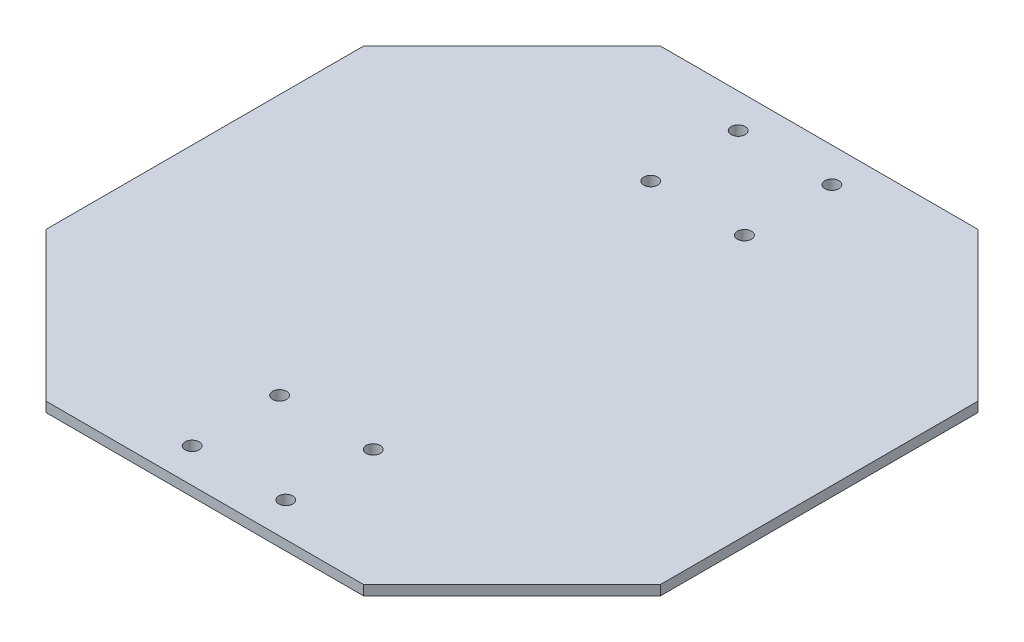
ISO-10303-21;
HEADER;
FILE_DESCRIPTION(('STEP AP214'),'2;1');
FILE_NAME('part.step','',(''),(''),'','','');
FILE_SCHEMA(('AUTOMOTIVE_DESIGN { 1 0 10303 214 1 1 1 1 }'));
ENDSEC;
DATA;
#1=APPLICATION_CONTEXT('core data for automotive mechanical design processes');
#2=APPLICATION_PROTOCOL_DEFINITION('international standard','automotive_design',2000,#1);
#3=PRODUCT_CONTEXT('',#1,'mechanical');
#4=PRODUCT('Part','Part','',(#3));
#5=PRODUCT_RELATED_PRODUCT_CATEGORY('part','',(#4));
#6=PRODUCT_DEFINITION_FORMATION('','',#4);
#7=PRODUCT_DEFINITION_CONTEXT('part definition',#1,'design');
#8=PRODUCT_DEFINITION('design','',#6,#7);
#9=PRODUCT_DEFINITION_SHAPE('','',#8);
#10=(LENGTH_UNIT() NAMED_UNIT(*) SI_UNIT(.MILLI.,.METRE.));
#11=(NAMED_UNIT(*) PLANE_ANGLE_UNIT() SI_UNIT($,.RADIAN.));
#12=(NAMED_UNIT(*) SI_UNIT($,.STERADIAN.) SOLID_ANGLE_UNIT());
#13=UNCERTAINTY_MEASURE_WITH_UNIT(LENGTH_MEASURE(1.E-05),#10,'distance_accuracy_value','');
#14=(GEOMETRIC_REPRESENTATION_CONTEXT(3) GLOBAL_UNCERTAINTY_ASSIGNED_CONTEXT((#13)) GLOBAL_UNIT_ASSIGNED_CONTEXT((#10,
#11,#12)) REPRESENTATION_CONTEXT('',''));
#15=CARTESIAN_POINT('',(0.,0.,0.));
#16=DIRECTION('',(0.,0.,1.));
#17=DIRECTION('',(1.,0.,0.));
#18=AXIS2_PLACEMENT_3D('',#15,#16,#17);
#19=CARTESIAN_POINT('',(-98.425,3.175,-50.8));
#20=DIRECTION('',(1.,0.,0.));
#21=DIRECTION('',(0.,0.,-1.));
#22=AXIS2_PLACEMENT_3D('',#19,#20,#21);
#23=PLANE('',#22);
#24=DIRECTION('',(0.,0.,1.));
#25=VECTOR('',#24,1.);
#26=CARTESIAN_POINT('',(-98.425,0.,-50.8));
#27=LINE('',#26,#25);
#28=CARTESIAN_POINT('',(-98.425,0.,-50.8));
#29=VERTEX_POINT('',#28);
#30=CARTESIAN_POINT('',(-98.425,0.,50.8));
#31=VERTEX_POINT('',#30);
#32=EDGE_CURVE('E129',#29,#31,#27,.T.);
#33=ORIENTED_EDGE('',*,*,#32,.T.);
#34=DIRECTION('',(0.,-1.,0.));
#35=VECTOR('',#34,1.);
#36=CARTESIAN_POINT('',(-98.425,3.175,50.8));
#37=LINE('',#36,#35);
#38=CARTESIAN_POINT('',(-98.425,3.175,50.8));
#39=VERTEX_POINT('',#38);
#40=EDGE_CURVE('E11',#39,#31,#37,.T.);
#41=ORIENTED_EDGE('',*,*,#40,.F.);
#42=DIRECTION('',(0.,0.,1.));
#43=VECTOR('',#42,1.);
#44=CARTESIAN_POINT('',(-98.425,3.175,-50.8));
#45=LINE('',#44,#43);
#46=CARTESIAN_POINT('',(-98.425,3.175,-50.8));
#47=VERTEX_POINT('',#46);
#48=EDGE_CURVE('E144',#47,#39,#45,.T.);
#49=ORIENTED_EDGE('',*,*,#48,.F.);
#50=DIRECTION('',(0.,-1.,0.));
#51=VECTOR('',#50,1.);
#52=CARTESIAN_POINT('',(-98.425,3.175,-50.8));
#53=LINE('',#52,#51);
#54=EDGE_CURVE('E125',#47,#29,#53,.T.);
#55=ORIENTED_EDGE('',*,*,#54,.T.);
#56=EDGE_LOOP('',(#33,#41,#49,#55));
#57=FACE_BOUND('',#56,.T.);
#58=ADVANCED_FACE('F33',(#57),#23,.F.);
#59=CARTESIAN_POINT('',(-98.425,3.175,50.8));
#60=DIRECTION('',(0.707106781186548,0.,-0.707106781186548));
#61=DIRECTION('',(-0.707106781186548,0.,-0.707106781186548));
#62=AXIS2_PLACEMENT_3D('',#59,#60,#61);
#63=PLANE('',#62);
#64=DIRECTION('',(0.707106781186547,0.,0.707106781186547));
#65=VECTOR('',#64,1.);
#66=CARTESIAN_POINT('',(-98.425,0.,50.8));
#67=LINE('',#66,#65);
#68=CARTESIAN_POINT('',(-50.8,0.,98.425));
#69=VERTEX_POINT('',#68);
#70=EDGE_CURVE('E132',#31,#69,#67,.T.);
#71=ORIENTED_EDGE('',*,*,#70,.T.);
#72=DIRECTION('',(0.,-1.,0.));
#73=VECTOR('',#72,1.);
#74=CARTESIAN_POINT('',(-50.8,3.175,98.425));
#75=LINE('',#74,#73);
#76=CARTESIAN_POINT('',(-50.8,3.175,98.425));
#77=VERTEX_POINT('',#76);
#78=EDGE_CURVE('E41',#77,#69,#75,.T.);
#79=ORIENTED_EDGE('',*,*,#78,.F.);
#80=DIRECTION('',(0.707106781186547,0.,0.707106781186547));
#81=VECTOR('',#80,1.);
#82=CARTESIAN_POINT('',(-98.425,3.175,50.8));
#83=LINE('',#82,#81);
#84=EDGE_CURVE('E92',#39,#77,#83,.T.);
#85=ORIENTED_EDGE('',*,*,#84,.F.);
#86=ORIENTED_EDGE('',*,*,#40,.T.);
#87=EDGE_LOOP('',(#71,#79,#85,#86));
#88=FACE_BOUND('',#87,.T.);
#89=ADVANCED_FACE('F261',(#88),#63,.F.);
#90=CARTESIAN_POINT('',(-50.8,3.175,98.425));
#91=DIRECTION('',(0.,0.,-1.));
#92=DIRECTION('',(-1.,0.,0.));
#93=AXIS2_PLACEMENT_3D('',#90,#91,#92);
#94=PLANE('',#93);
#95=DIRECTION('',(1.,0.,0.));
#96=VECTOR('',#95,1.);
#97=CARTESIAN_POINT('',(-50.8,0.,98.425));
#98=LINE('',#97,#96);
#99=CARTESIAN_POINT('',(50.8,0.,98.425));
#100=VERTEX_POINT('',#99);
#101=EDGE_CURVE('E135',#69,#100,#98,.T.);
#102=ORIENTED_EDGE('',*,*,#101,.T.);
#103=DIRECTION('',(0.,-1.,0.));
#104=VECTOR('',#103,1.);
#105=CARTESIAN_POINT('',(50.8,3.175,98.425));
#106=LINE('',#105,#104);
#107=CARTESIAN_POINT('',(50.8,3.175,98.425));
#108=VERTEX_POINT('',#107);
#109=EDGE_CURVE('E151',#108,#100,#106,.T.);
#110=ORIENTED_EDGE('',*,*,#109,.F.);
#111=DIRECTION('',(1.,0.,0.));
#112=VECTOR('',#111,1.);
#113=CARTESIAN_POINT('',(-50.8,3.175,98.425));
#114=LINE('',#113,#112);
#115=EDGE_CURVE('E159',#77,#108,#114,.T.);
#116=ORIENTED_EDGE('',*,*,#115,.F.);
#117=ORIENTED_EDGE('',*,*,#78,.T.);
#118=EDGE_LOOP('',(#102,#110,#116,#117));
#119=FACE_BOUND('',#118,.T.);
#120=ADVANCED_FACE('F157',(#119),#94,.F.);
#121=CARTESIAN_POINT('',(50.8,3.175,98.425));
#122=DIRECTION('',(-0.707106781186547,0.,-0.707106781186548));
#123=DIRECTION('',(-0.707106781186548,0.,0.707106781186547));
#124=AXIS2_PLACEMENT_3D('',#121,#122,#123);
#125=PLANE('',#124);
#126=DIRECTION('',(0.707106781186548,0.,-0.707106781186547));
#127=VECTOR('',#126,1.);
#128=CARTESIAN_POINT('',(50.8,0.,98.425));
#129=LINE('',#128,#127);
#130=CARTESIAN_POINT('',(98.425,0.,50.8));
#131=VERTEX_POINT('',#130);
#132=EDGE_CURVE('E137',#100,#131,#129,.T.);
#133=ORIENTED_EDGE('',*,*,#132,.T.);
#134=DIRECTION('',(0.,-1.,0.));
#135=VECTOR('',#134,1.);
#136=CARTESIAN_POINT('',(98.425,3.175,50.8));
#137=LINE('',#136,#135);
#138=CARTESIAN_POINT('',(98.425,3.175,50.8));
#139=VERTEX_POINT('',#138);
#140=EDGE_CURVE('E148',#139,#131,#137,.T.);
#141=ORIENTED_EDGE('',*,*,#140,.F.);
#142=DIRECTION('',(0.707106781186548,0.,-0.707106781186547));
#143=VECTOR('',#142,1.);
#144=CARTESIAN_POINT('',(50.8,3.175,98.425));
#145=LINE('',#144,#143);
#146=EDGE_CURVE('E171',#108,#139,#145,.T.);
#147=ORIENTED_EDGE('',*,*,#146,.F.);
#148=ORIENTED_EDGE('',*,*,#109,.T.);
#149=EDGE_LOOP('',(#133,#141,#147,#148));
#150=FACE_BOUND('',#149,.T.);
#151=ADVANCED_FACE('F167',(#150),#125,.F.);
#152=CARTESIAN_POINT('',(98.425,3.175,-50.8));
#153=DIRECTION('',(-1.,0.,0.));
#154=DIRECTION('',(0.,0.,1.));
#155=AXIS2_PLACEMENT_3D('',#152,#153,#154);
#156=PLANE('',#155);
#157=DIRECTION('',(0.,0.,-1.));
#158=VECTOR('',#157,1.);
#159=CARTESIAN_POINT('',(98.425,0.,-50.8));
#160=LINE('',#159,#158);
#161=CARTESIAN_POINT('',(98.425,0.,-50.8));
#162=VERTEX_POINT('',#161);
#163=EDGE_CURVE('E139',#131,#162,#160,.T.);
#164=ORIENTED_EDGE('',*,*,#163,.T.);
#165=DIRECTION('',(0.,-1.,0.));
#166=VECTOR('',#165,1.);
#167=CARTESIAN_POINT('',(98.425,3.175,-50.8));
#168=LINE('',#167,#166);
#169=CARTESIAN_POINT('',(98.425,3.175,-50.8));
#170=VERTEX_POINT('',#169);
#171=EDGE_CURVE('E120',#170,#162,#168,.T.);
#172=ORIENTED_EDGE('',*,*,#171,.F.);
#173=DIRECTION('',(0.,0.,-1.));
#174=VECTOR('',#173,1.);
#175=CARTESIAN_POINT('',(98.425,3.175,-50.8));
#176=LINE('',#175,#174);
#177=EDGE_CURVE('E111',#139,#170,#176,.T.);
#178=ORIENTED_EDGE('',*,*,#177,.F.);
#179=ORIENTED_EDGE('',*,*,#140,.T.);
#180=EDGE_LOOP('',(#164,#172,#178,#179));
#181=FACE_BOUND('',#180,.T.);
#182=ADVANCED_FACE('F170',(#181),#156,.F.);
#183=CARTESIAN_POINT('',(50.8,3.175,-98.425));
#184=DIRECTION('',(-0.707106781186547,0.,0.707106781186548));
#185=DIRECTION('',(0.707106781186548,0.,0.707106781186547));
#186=AXIS2_PLACEMENT_3D('',#183,#184,#185);
#187=PLANE('',#186);
#188=DIRECTION('',(-0.707106781186548,0.,-0.707106781186547));
#189=VECTOR('',#188,1.);
#190=CARTESIAN_POINT('',(50.8,0.,-98.425));
#191=LINE('',#190,#189);
#192=CARTESIAN_POINT('',(50.8,0.,-98.425));
#193=VERTEX_POINT('',#192);
#194=EDGE_CURVE('E119',#162,#193,#191,.T.);
#195=ORIENTED_EDGE('',*,*,#194,.T.);
#196=DIRECTION('',(0.,-1.,0.));
#197=VECTOR('',#196,1.);
#198=CARTESIAN_POINT('',(50.8,3.175,-98.425));
#199=LINE('',#198,#197);
#200=CARTESIAN_POINT('',(50.8,3.175,-98.425));
#201=VERTEX_POINT('',#200);
#202=EDGE_CURVE('E116',#201,#193,#199,.T.);
#203=ORIENTED_EDGE('',*,*,#202,.F.);
#204=DIRECTION('',(-0.707106781186548,0.,-0.707106781186547));
#205=VECTOR('',#204,1.);
#206=CARTESIAN_POINT('',(50.8,3.175,-98.425));
#207=LINE('',#206,#205);
#208=EDGE_CURVE('E105',#170,#201,#207,.T.);
#209=ORIENTED_EDGE('',*,*,#208,.F.);
#210=ORIENTED_EDGE('',*,*,#171,.T.);
#211=EDGE_LOOP('',(#195,#203,#209,#210));
#212=FACE_BOUND('',#211,.T.);
#213=ADVANCED_FACE('F117',(#212),#187,.F.);
#214=CARTESIAN_POINT('',(-50.8,3.175,-98.425));
#215=DIRECTION('',(0.,0.,1.));
#216=DIRECTION('',(1.,0.,0.));
#217=AXIS2_PLACEMENT_3D('',#214,#215,#216);
#218=PLANE('',#217);
#219=DIRECTION('',(-1.,0.,0.));
#220=VECTOR('',#219,1.);
#221=CARTESIAN_POINT('',(-50.8,0.,-98.425));
#222=LINE('',#221,#220);
#223=CARTESIAN_POINT('',(-50.8,0.,-98.425));
#224=VERTEX_POINT('',#223);
#225=EDGE_CURVE('E78',#193,#224,#222,.T.);
#226=ORIENTED_EDGE('',*,*,#225,.T.);
#227=DIRECTION('',(0.,-1.,0.));
#228=VECTOR('',#227,1.);
#229=CARTESIAN_POINT('',(-50.8,3.175,-98.425));
#230=LINE('',#229,#228);
#231=CARTESIAN_POINT('',(-50.8,3.175,-98.425));
#232=VERTEX_POINT('',#231);
#233=EDGE_CURVE('E121',#232,#224,#230,.T.);
#234=ORIENTED_EDGE('',*,*,#233,.F.);
#235=DIRECTION('',(-1.,0.,0.));
#236=VECTOR('',#235,1.);
#237=CARTESIAN_POINT('',(-50.8,3.175,-98.425));
#238=LINE('',#237,#236);
#239=EDGE_CURVE('E109',#201,#232,#238,.T.);
#240=ORIENTED_EDGE('',*,*,#239,.F.);
#241=ORIENTED_EDGE('',*,*,#202,.T.);
#242=EDGE_LOOP('',(#226,#234,#240,#241));
#243=FACE_BOUND('',#242,.T.);
#244=ADVANCED_FACE('F123',(#243),#218,.F.);
#245=CARTESIAN_POINT('',(-98.425,3.175,-50.8));
#246=DIRECTION('',(0.707106781186548,0.,0.707106781186547));
#247=DIRECTION('',(0.707106781186547,0.,-0.707106781186548));
#248=AXIS2_PLACEMENT_3D('',#245,#246,#247);
#249=PLANE('',#248);
#250=DIRECTION('',(-0.707106781186547,0.,0.707106781186548));
#251=VECTOR('',#250,1.);
#252=CARTESIAN_POINT('',(-98.425,0.,-50.8));
#253=LINE('',#252,#251);
#254=EDGE_CURVE('E84',#224,#29,#253,.T.);
#255=ORIENTED_EDGE('',*,*,#254,.T.);
#256=ORIENTED_EDGE('',*,*,#54,.F.);
#257=DIRECTION('',(-0.707106781186547,0.,0.707106781186548));
#258=VECTOR('',#257,1.);
#259=CARTESIAN_POINT('',(-98.425,3.175,-50.8));
#260=LINE('',#259,#258);
#261=EDGE_CURVE('E49',#232,#47,#260,.T.);
#262=ORIENTED_EDGE('',*,*,#261,.F.);
#263=ORIENTED_EDGE('',*,*,#233,.T.);
#264=EDGE_LOOP('',(#255,#256,#262,#263));
#265=FACE_BOUND('',#264,.T.);
#266=ADVANCED_FACE('F229',(#265),#249,.F.);
#267=CARTESIAN_POINT('',(0.,3.175,0.));
#268=DIRECTION('',(0.,1.,0.));
#269=DIRECTION('',(0.,0.,1.));
#270=AXIS2_PLACEMENT_3D('',#267,#268,#269);
#271=PLANE('',#270);
#272=CARTESIAN_POINT('',(-15.,3.175,87.425));
#273=DIRECTION('',(0.,1.,0.));
#274=DIRECTION('',(0.,0.,1.));
#275=AXIS2_PLACEMENT_3D('',#272,#273,#274);
#276=CIRCLE('',#275,2.25);
#277=CARTESIAN_POINT('',(-15.,3.175,89.675));
#278=VERTEX_POINT('',#277);
#279=EDGE_CURVE('E221',#278,#278,#276,.T.);
#280=ORIENTED_EDGE('',*,*,#279,.F.);
#281=EDGE_LOOP('',(#280));
#282=FACE_BOUND('',#281,.T.);
#283=CARTESIAN_POINT('',(-15.,3.175,59.425));
#284=DIRECTION('',(0.,1.,0.));
#285=DIRECTION('',(0.,0.,1.));
#286=AXIS2_PLACEMENT_3D('',#283,#284,#285);
#287=CIRCLE('',#286,2.25);
#288=CARTESIAN_POINT('',(-15.,3.175,61.675));
#289=VERTEX_POINT('',#288);
#290=EDGE_CURVE('E215',#289,#289,#287,.T.);
#291=ORIENTED_EDGE('',*,*,#290,.F.);
#292=EDGE_LOOP('',(#291));
#293=FACE_BOUND('',#292,.T.);
#294=CARTESIAN_POINT('',(15.,3.175,59.425));
#295=DIRECTION('',(0.,1.,0.));
#296=DIRECTION('',(0.,0.,1.));
#297=AXIS2_PLACEMENT_3D('',#294,#295,#296);
#298=CIRCLE('',#297,2.25);
#299=CARTESIAN_POINT('',(15.,3.175,61.675));
#300=VERTEX_POINT('',#299);
#301=EDGE_CURVE('E209',#300,#300,#298,.T.);
#302=ORIENTED_EDGE('',*,*,#301,.F.);
#303=EDGE_LOOP('',(#302));
#304=FACE_BOUND('',#303,.T.);
#305=CARTESIAN_POINT('',(15.,3.175,87.425));
#306=DIRECTION('',(0.,1.,0.));
#307=DIRECTION('',(0.,0.,1.));
#308=AXIS2_PLACEMENT_3D('',#305,#306,#307);
#309=CIRCLE('',#308,2.25);
#310=CARTESIAN_POINT('',(15.,3.175,89.675));
#311=VERTEX_POINT('',#310);
#312=EDGE_CURVE('E203',#311,#311,#309,.T.);
#313=ORIENTED_EDGE('',*,*,#312,.F.);
#314=EDGE_LOOP('',(#313));
#315=FACE_BOUND('',#314,.T.);
#316=CARTESIAN_POINT('',(-15.,3.175,-87.425));
#317=DIRECTION('',(0.,1.,0.));
#318=DIRECTION('',(0.,0.,1.));
#319=AXIS2_PLACEMENT_3D('',#316,#317,#318);
#320=CIRCLE('',#319,2.25);
#321=CARTESIAN_POINT('',(-15.,3.175,-85.175));
#322=VERTEX_POINT('',#321);
#323=EDGE_CURVE('E197',#322,#322,#320,.T.);
#324=ORIENTED_EDGE('',*,*,#323,.F.);
#325=EDGE_LOOP('',(#324));
#326=FACE_BOUND('',#325,.T.);
#327=CARTESIAN_POINT('',(-15.,3.175,-59.425));
#328=DIRECTION('',(0.,1.,0.));
#329=DIRECTION('',(0.,0.,1.));
#330=AXIS2_PLACEMENT_3D('',#327,#328,#329);
#331=CIRCLE('',#330,2.25);
#332=CARTESIAN_POINT('',(-15.,3.175,-57.175));
#333=VERTEX_POINT('',#332);
#334=EDGE_CURVE('E191',#333,#333,#331,.T.);
#335=ORIENTED_EDGE('',*,*,#334,.F.);
#336=EDGE_LOOP('',(#335));
#337=FACE_BOUND('',#336,.T.);
#338=CARTESIAN_POINT('',(15.,3.175,-59.425));
#339=DIRECTION('',(0.,1.,0.));
#340=DIRECTION('',(0.,0.,1.));
#341=AXIS2_PLACEMENT_3D('',#338,#339,#340);
#342=CIRCLE('',#341,2.25);
#343=CARTESIAN_POINT('',(15.,3.175,-57.175));
#344=VERTEX_POINT('',#343);
#345=EDGE_CURVE('E185',#344,#344,#342,.T.);
#346=ORIENTED_EDGE('',*,*,#345,.F.);
#347=EDGE_LOOP('',(#346));
#348=FACE_BOUND('',#347,.T.);
#349=CARTESIAN_POINT('',(15.,3.175,-87.425));
#350=DIRECTION('',(0.,1.,0.));
#351=DIRECTION('',(0.,0.,1.));
#352=AXIS2_PLACEMENT_3D('',#349,#350,#351);
#353=CIRCLE('',#352,2.25);
#354=CARTESIAN_POINT('',(15.,3.175,-85.175));
#355=VERTEX_POINT('',#354);
#356=EDGE_CURVE('E179',#355,#355,#353,.T.);
#357=ORIENTED_EDGE('',*,*,#356,.F.);
#358=EDGE_LOOP('',(#357));
#359=FACE_BOUND('',#358,.T.);
#360=ORIENTED_EDGE('',*,*,#48,.T.);
#361=ORIENTED_EDGE('',*,*,#84,.T.);
#362=ORIENTED_EDGE('',*,*,#115,.T.);
#363=ORIENTED_EDGE('',*,*,#146,.T.);
#364=ORIENTED_EDGE('',*,*,#177,.T.);
#365=ORIENTED_EDGE('',*,*,#208,.T.);
#366=ORIENTED_EDGE('',*,*,#239,.T.);
#367=ORIENTED_EDGE('',*,*,#261,.T.);
#368=EDGE_LOOP('',(#360,#361,#362,#363,#364,#365,#366,#367));
#369=FACE_BOUND('',#368,.T.);
#370=ADVANCED_FACE('F107',(#282,#293,#304,#315,#326,#337,#348,#359,#369),#271,.T.);
#371=CARTESIAN_POINT('',(0.,0.,0.));
#372=DIRECTION('',(0.,1.,0.));
#373=DIRECTION('',(0.,0.,1.));
#374=AXIS2_PLACEMENT_3D('',#371,#372,#373);
#375=PLANE('',#374);
#376=CARTESIAN_POINT('',(-15.,0.,87.425));
#377=DIRECTION('',(0.,1.,0.));
#378=DIRECTION('',(0.,0.,1.));
#379=AXIS2_PLACEMENT_3D('',#376,#377,#378);
#380=CIRCLE('',#379,2.25);
#381=CARTESIAN_POINT('',(-15.,0.,89.675));
#382=VERTEX_POINT('',#381);
#383=EDGE_CURVE('E218',#382,#382,#380,.T.);
#384=ORIENTED_EDGE('',*,*,#383,.T.);
#385=EDGE_LOOP('',(#384));
#386=FACE_BOUND('',#385,.T.);
#387=CARTESIAN_POINT('',(-15.,0.,59.425));
#388=DIRECTION('',(0.,1.,0.));
#389=DIRECTION('',(0.,0.,1.));
#390=AXIS2_PLACEMENT_3D('',#387,#388,#389);
#391=CIRCLE('',#390,2.25);
#392=CARTESIAN_POINT('',(-15.,0.,61.675));
#393=VERTEX_POINT('',#392);
#394=EDGE_CURVE('E212',#393,#393,#391,.T.);
#395=ORIENTED_EDGE('',*,*,#394,.T.);
#396=EDGE_LOOP('',(#395));
#397=FACE_BOUND('',#396,.T.);
#398=CARTESIAN_POINT('',(15.,0.,59.425));
#399=DIRECTION('',(0.,1.,0.));
#400=DIRECTION('',(0.,0.,1.));
#401=AXIS2_PLACEMENT_3D('',#398,#399,#400);
#402=CIRCLE('',#401,2.25);
#403=CARTESIAN_POINT('',(15.,0.,61.675));
#404=VERTEX_POINT('',#403);
#405=EDGE_CURVE('E206',#404,#404,#402,.T.);
#406=ORIENTED_EDGE('',*,*,#405,.T.);
#407=EDGE_LOOP('',(#406));
#408=FACE_BOUND('',#407,.T.);
#409=CARTESIAN_POINT('',(15.,0.,87.425));
#410=DIRECTION('',(0.,1.,0.));
#411=DIRECTION('',(0.,0.,1.));
#412=AXIS2_PLACEMENT_3D('',#409,#410,#411);
#413=CIRCLE('',#412,2.25);
#414=CARTESIAN_POINT('',(15.,0.,89.675));
#415=VERTEX_POINT('',#414);
#416=EDGE_CURVE('E200',#415,#415,#413,.T.);
#417=ORIENTED_EDGE('',*,*,#416,.T.);
#418=EDGE_LOOP('',(#417));
#419=FACE_BOUND('',#418,.T.);
#420=CARTESIAN_POINT('',(-15.,0.,-87.425));
#421=DIRECTION('',(0.,1.,0.));
#422=DIRECTION('',(0.,0.,1.));
#423=AXIS2_PLACEMENT_3D('',#420,#421,#422);
#424=CIRCLE('',#423,2.25);
#425=CARTESIAN_POINT('',(-15.,0.,-85.175));
#426=VERTEX_POINT('',#425);
#427=EDGE_CURVE('E194',#426,#426,#424,.T.);
#428=ORIENTED_EDGE('',*,*,#427,.T.);
#429=EDGE_LOOP('',(#428));
#430=FACE_BOUND('',#429,.T.);
#431=CARTESIAN_POINT('',(-15.,0.,-59.425));
#432=DIRECTION('',(0.,1.,0.));
#433=DIRECTION('',(0.,0.,1.));
#434=AXIS2_PLACEMENT_3D('',#431,#432,#433);
#435=CIRCLE('',#434,2.25);
#436=CARTESIAN_POINT('',(-15.,0.,-57.175));
#437=VERTEX_POINT('',#436);
#438=EDGE_CURVE('E188',#437,#437,#435,.T.);
#439=ORIENTED_EDGE('',*,*,#438,.T.);
#440=EDGE_LOOP('',(#439));
#441=FACE_BOUND('',#440,.T.);
#442=CARTESIAN_POINT('',(15.,0.,-59.425));
#443=DIRECTION('',(0.,1.,0.));
#444=DIRECTION('',(0.,0.,1.));
#445=AXIS2_PLACEMENT_3D('',#442,#443,#444);
#446=CIRCLE('',#445,2.25);
#447=CARTESIAN_POINT('',(15.,0.,-57.175));
#448=VERTEX_POINT('',#447);
#449=EDGE_CURVE('E182',#448,#448,#446,.T.);
#450=ORIENTED_EDGE('',*,*,#449,.T.);
#451=EDGE_LOOP('',(#450));
#452=FACE_BOUND('',#451,.T.);
#453=CARTESIAN_POINT('',(15.,0.,-87.425));
#454=DIRECTION('',(0.,1.,0.));
#455=DIRECTION('',(0.,0.,1.));
#456=AXIS2_PLACEMENT_3D('',#453,#454,#455);
#457=CIRCLE('',#456,2.25);
#458=CARTESIAN_POINT('',(15.,0.,-85.175));
#459=VERTEX_POINT('',#458);
#460=EDGE_CURVE('E133',#459,#459,#457,.T.);
#461=ORIENTED_EDGE('',*,*,#460,.T.);
#462=EDGE_LOOP('',(#461));
#463=FACE_BOUND('',#462,.T.);
#464=ORIENTED_EDGE('',*,*,#32,.F.);
#465=ORIENTED_EDGE('',*,*,#254,.F.);
#466=ORIENTED_EDGE('',*,*,#225,.F.);
#467=ORIENTED_EDGE('',*,*,#194,.F.);
#468=ORIENTED_EDGE('',*,*,#163,.F.);
#469=ORIENTED_EDGE('',*,*,#132,.F.);
#470=ORIENTED_EDGE('',*,*,#101,.F.);
#471=ORIENTED_EDGE('',*,*,#70,.F.);
#472=EDGE_LOOP('',(#464,#465,#466,#467,#468,#469,#470,#471));
#473=FACE_BOUND('',#472,.T.);
#474=ADVANCED_FACE('F163',(#386,#397,#408,#419,#430,#441,#452,#463,#473),#375,.F.);
#475=CARTESIAN_POINT('',(15.,3.175,-87.425));
#476=DIRECTION('',(0.,1.,0.));
#477=DIRECTION('',(0.,0.,1.));
#478=AXIS2_PLACEMENT_3D('',#475,#476,#477);
#479=CYLINDRICAL_SURFACE('',#478,2.25);
#480=ORIENTED_EDGE('',*,*,#460,.F.);
#481=EDGE_LOOP('',(#480));
#482=FACE_BOUND('',#481,.T.);
#483=ORIENTED_EDGE('',*,*,#356,.T.);
#484=EDGE_LOOP('',(#483));
#485=FACE_BOUND('',#484,.T.);
#486=ADVANCED_FACE('F245',(#482,#485),#479,.F.);
#487=CARTESIAN_POINT('',(15.,3.175,-59.425));
#488=DIRECTION('',(0.,1.,0.));
#489=DIRECTION('',(0.,0.,1.));
#490=AXIS2_PLACEMENT_3D('',#487,#488,#489);
#491=CYLINDRICAL_SURFACE('',#490,2.25);
#492=ORIENTED_EDGE('',*,*,#449,.F.);
#493=EDGE_LOOP('',(#492));
#494=FACE_BOUND('',#493,.T.);
#495=ORIENTED_EDGE('',*,*,#345,.T.);
#496=EDGE_LOOP('',(#495));
#497=FACE_BOUND('',#496,.T.);
#498=ADVANCED_FACE('F247',(#494,#497),#491,.F.);
#499=CARTESIAN_POINT('',(-15.,3.175,-59.425));
#500=DIRECTION('',(0.,1.,0.));
#501=DIRECTION('',(0.,0.,1.));
#502=AXIS2_PLACEMENT_3D('',#499,#500,#501);
#503=CYLINDRICAL_SURFACE('',#502,2.25);
#504=ORIENTED_EDGE('',*,*,#438,.F.);
#505=EDGE_LOOP('',(#504));
#506=FACE_BOUND('',#505,.T.);
#507=ORIENTED_EDGE('',*,*,#334,.T.);
#508=EDGE_LOOP('',(#507));
#509=FACE_BOUND('',#508,.T.);
#510=ADVANCED_FACE('F254',(#506,#509),#503,.F.);
#511=CARTESIAN_POINT('',(-15.,3.175,-87.425));
#512=DIRECTION('',(0.,1.,0.));
#513=DIRECTION('',(0.,0.,1.));
#514=AXIS2_PLACEMENT_3D('',#511,#512,#513);
#515=CYLINDRICAL_SURFACE('',#514,2.25);
#516=ORIENTED_EDGE('',*,*,#427,.F.);
#517=EDGE_LOOP('',(#516));
#518=FACE_BOUND('',#517,.T.);
#519=ORIENTED_EDGE('',*,*,#323,.T.);
#520=EDGE_LOOP('',(#519));
#521=FACE_BOUND('',#520,.T.);
#522=ADVANCED_FACE('F327',(#518,#521),#515,.F.);
#523=CARTESIAN_POINT('',(15.,3.175,87.425));
#524=DIRECTION('',(0.,1.,0.));
#525=DIRECTION('',(0.,0.,1.));
#526=AXIS2_PLACEMENT_3D('',#523,#524,#525);
#527=CYLINDRICAL_SURFACE('',#526,2.25);
#528=ORIENTED_EDGE('',*,*,#416,.F.);
#529=EDGE_LOOP('',(#528));
#530=FACE_BOUND('',#529,.T.);
#531=ORIENTED_EDGE('',*,*,#312,.T.);
#532=EDGE_LOOP('',(#531));
#533=FACE_BOUND('',#532,.T.);
#534=ADVANCED_FACE('F337',(#530,#533),#527,.F.);
#535=CARTESIAN_POINT('',(15.,3.175,59.425));
#536=DIRECTION('',(0.,1.,0.));
#537=DIRECTION('',(0.,0.,1.));
#538=AXIS2_PLACEMENT_3D('',#535,#536,#537);
#539=CYLINDRICAL_SURFACE('',#538,2.25);
#540=ORIENTED_EDGE('',*,*,#405,.F.);
#541=EDGE_LOOP('',(#540));
#542=FACE_BOUND('',#541,.T.);
#543=ORIENTED_EDGE('',*,*,#301,.T.);
#544=EDGE_LOOP('',(#543));
#545=FACE_BOUND('',#544,.T.);
#546=ADVANCED_FACE('F357',(#542,#545),#539,.F.);
#547=CARTESIAN_POINT('',(-15.,3.175,59.425));
#548=DIRECTION('',(0.,1.,0.));
#549=DIRECTION('',(0.,0.,1.));
#550=AXIS2_PLACEMENT_3D('',#547,#548,#549);
#551=CYLINDRICAL_SURFACE('',#550,2.25);
#552=ORIENTED_EDGE('',*,*,#394,.F.);
#553=EDGE_LOOP('',(#552));
#554=FACE_BOUND('',#553,.T.);
#555=ORIENTED_EDGE('',*,*,#290,.T.);
#556=EDGE_LOOP('',(#555));
#557=FACE_BOUND('',#556,.T.);
#558=ADVANCED_FACE('F367',(#554,#557),#551,.F.);
#559=CARTESIAN_POINT('',(-15.,3.175,87.425));
#560=DIRECTION('',(0.,1.,0.));
#561=DIRECTION('',(0.,0.,1.));
#562=AXIS2_PLACEMENT_3D('',#559,#560,#561);
#563=CYLINDRICAL_SURFACE('',#562,2.25);
#564=ORIENTED_EDGE('',*,*,#383,.F.);
#565=EDGE_LOOP('',(#564));
#566=FACE_BOUND('',#565,.T.);
#567=ORIENTED_EDGE('',*,*,#279,.T.);
#568=EDGE_LOOP('',(#567));
#569=FACE_BOUND('',#568,.T.);
#570=ADVANCED_FACE('F225',(#566,#569),#563,.F.);
#571=CLOSED_SHELL('',(#58,#89,#120,#151,#182,#213,#244,#266,#370,#474,#486,#498,#510,#522,#534,
#546,#558,#570));
#572=MANIFOLD_SOLID_BREP('B2',#571);
#573=ADVANCED_BREP_SHAPE_REPRESENTATION('',(#18,#572),#14);
#574=SHAPE_DEFINITION_REPRESENTATION(#9,#573);
ENDSEC;
END-ISO-10303-21;
